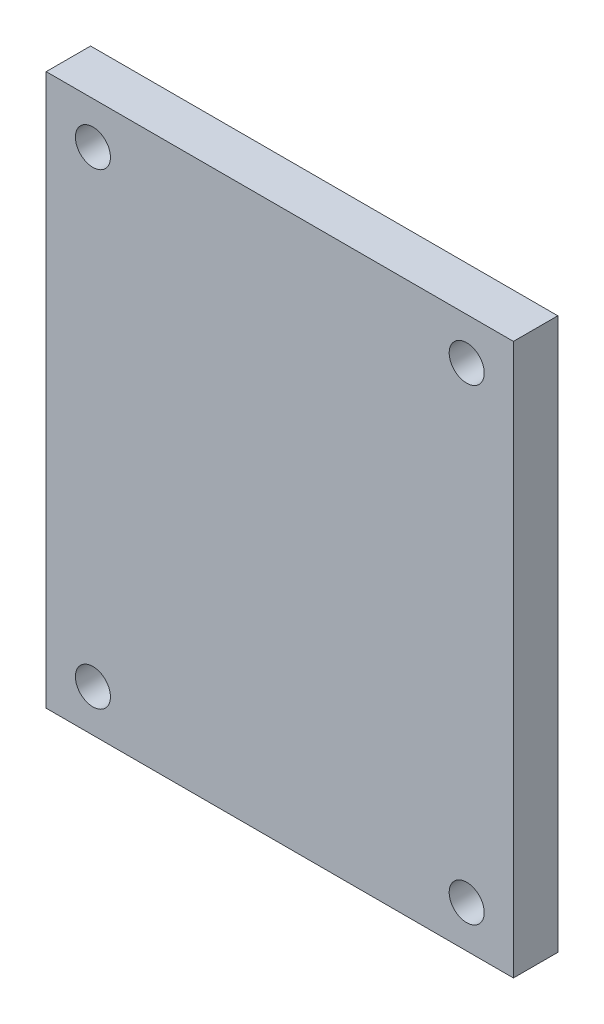
ISO-10303-21;
HEADER;
FILE_DESCRIPTION(('STEP AP214'),'2;1');
FILE_NAME('part.step','',(''),(''),'','','');
FILE_SCHEMA(('AUTOMOTIVE_DESIGN { 1 0 10303 214 1 1 1 1 }'));
ENDSEC;
DATA;
#1=APPLICATION_CONTEXT('core data for automotive mechanical design processes');
#2=APPLICATION_PROTOCOL_DEFINITION('international standard','automotive_design',2000,#1);
#3=PRODUCT_CONTEXT('',#1,'mechanical');
#4=PRODUCT('Part','Part','',(#3));
#5=PRODUCT_RELATED_PRODUCT_CATEGORY('part','',(#4));
#6=PRODUCT_DEFINITION_FORMATION('','',#4);
#7=PRODUCT_DEFINITION_CONTEXT('part definition',#1,'design');
#8=PRODUCT_DEFINITION('design','',#6,#7);
#9=PRODUCT_DEFINITION_SHAPE('','',#8);
#10=(LENGTH_UNIT() NAMED_UNIT(*) SI_UNIT(.MILLI.,.METRE.));
#11=(NAMED_UNIT(*) PLANE_ANGLE_UNIT() SI_UNIT($,.RADIAN.));
#12=(NAMED_UNIT(*) SI_UNIT($,.STERADIAN.) SOLID_ANGLE_UNIT());
#13=UNCERTAINTY_MEASURE_WITH_UNIT(LENGTH_MEASURE(1.E-05),#10,'distance_accuracy_value','');
#14=(GEOMETRIC_REPRESENTATION_CONTEXT(3) GLOBAL_UNCERTAINTY_ASSIGNED_CONTEXT((#13)) GLOBAL_UNIT_ASSIGNED_CONTEXT((#10,
#11,#12)) REPRESENTATION_CONTEXT('',''));
#15=CARTESIAN_POINT('',(0.,0.,0.));
#16=DIRECTION('',(0.,0.,1.));
#17=DIRECTION('',(1.,0.,0.));
#18=AXIS2_PLACEMENT_3D('',#15,#16,#17);
#19=CARTESIAN_POINT('',(0.,0.,4.826));
#20=DIRECTION('',(0.,0.,-1.));
#21=DIRECTION('',(-1.,0.,0.));
#22=AXIS2_PLACEMENT_3D('',#19,#20,#21);
#23=PLANE('',#22);
#24=DIRECTION('',(0.,-1.,0.));
#25=VECTOR('',#24,1.);
#26=CARTESIAN_POINT('',(0.,0.,4.826));
#27=LINE('',#26,#25);
#28=CARTESIAN_POINT('',(0.,59.944,4.826));
#29=VERTEX_POINT('',#28);
#30=CARTESIAN_POINT('',(0.,0.,4.826));
#31=VERTEX_POINT('',#30);
#32=EDGE_CURVE('E85',#29,#31,#27,.T.);
#33=ORIENTED_EDGE('',*,*,#32,.T.);
#34=DIRECTION('',(1.,0.,0.));
#35=VECTOR('',#34,1.);
#36=CARTESIAN_POINT('',(0.,0.,4.826));
#37=LINE('',#36,#35);
#38=CARTESIAN_POINT('',(50.8,0.,4.826));
#39=VERTEX_POINT('',#38);
#40=EDGE_CURVE('E80',#31,#39,#37,.T.);
#41=ORIENTED_EDGE('',*,*,#40,.T.);
#42=DIRECTION('',(0.,1.,0.));
#43=VECTOR('',#42,1.);
#44=CARTESIAN_POINT('',(50.8,0.,4.826));
#45=LINE('',#44,#43);
#46=CARTESIAN_POINT('',(50.8,59.944,4.826));
#47=VERTEX_POINT('',#46);
#48=EDGE_CURVE('E83',#39,#47,#45,.T.);
#49=ORIENTED_EDGE('',*,*,#48,.T.);
#50=DIRECTION('',(-1.,0.,0.));
#51=VECTOR('',#50,1.);
#52=CARTESIAN_POINT('',(0.,59.944,4.826));
#53=LINE('',#52,#51);
#54=EDGE_CURVE('E50',#47,#29,#53,.T.);
#55=ORIENTED_EDGE('',*,*,#54,.T.);
#56=EDGE_LOOP('',(#33,#41,#49,#55));
#57=FACE_BOUND('',#56,.T.);
#58=CARTESIAN_POINT('',(5.08,55.372,4.826));
#59=DIRECTION('',(0.,0.,1.));
#60=DIRECTION('',(1.,0.,0.));
#61=AXIS2_PLACEMENT_3D('',#58,#59,#60);
#62=CIRCLE('',#61,1.905);
#63=CARTESIAN_POINT('',(6.985,55.372,4.826));
#64=VERTEX_POINT('',#63);
#65=EDGE_CURVE('E100',#64,#64,#62,.T.);
#66=ORIENTED_EDGE('',*,*,#65,.F.);
#67=EDGE_LOOP('',(#66));
#68=FACE_BOUND('',#67,.T.);
#69=CARTESIAN_POINT('',(5.08,4.57200000000001,4.826));
#70=DIRECTION('',(0.,0.,1.));
#71=DIRECTION('',(1.,0.,0.));
#72=AXIS2_PLACEMENT_3D('',#69,#70,#71);
#73=CIRCLE('',#72,1.905);
#74=CARTESIAN_POINT('',(6.985,4.57200000000001,4.826));
#75=VERTEX_POINT('',#74);
#76=EDGE_CURVE('E115',#75,#75,#73,.T.);
#77=ORIENTED_EDGE('',*,*,#76,.F.);
#78=EDGE_LOOP('',(#77));
#79=FACE_BOUND('',#78,.T.);
#80=CARTESIAN_POINT('',(45.72,55.372,4.826));
#81=DIRECTION('',(0.,0.,1.));
#82=DIRECTION('',(1.,0.,0.));
#83=AXIS2_PLACEMENT_3D('',#80,#81,#82);
#84=CIRCLE('',#83,1.905);
#85=CARTESIAN_POINT('',(47.625,55.372,4.826));
#86=VERTEX_POINT('',#85);
#87=EDGE_CURVE('E121',#86,#86,#84,.T.);
#88=ORIENTED_EDGE('',*,*,#87,.F.);
#89=EDGE_LOOP('',(#88));
#90=FACE_BOUND('',#89,.T.);
#91=CARTESIAN_POINT('',(45.72,4.57200000000003,4.826));
#92=DIRECTION('',(0.,0.,1.));
#93=DIRECTION('',(1.,0.,0.));
#94=AXIS2_PLACEMENT_3D('',#91,#92,#93);
#95=CIRCLE('',#94,1.905);
#96=CARTESIAN_POINT('',(47.625,4.57200000000003,4.826));
#97=VERTEX_POINT('',#96);
#98=EDGE_CURVE('E127',#97,#97,#95,.T.);
#99=ORIENTED_EDGE('',*,*,#98,.F.);
#100=EDGE_LOOP('',(#99));
#101=FACE_BOUND('',#100,.T.);
#102=ADVANCED_FACE('F33',(#57,#68,#79,#90,#101),#23,.F.);
#103=CARTESIAN_POINT('',(0.,0.,0.));
#104=DIRECTION('',(0.,0.,-1.));
#105=DIRECTION('',(-1.,0.,0.));
#106=AXIS2_PLACEMENT_3D('',#103,#104,#105);
#107=PLANE('',#106);
#108=CARTESIAN_POINT('',(45.72,55.372,0.));
#109=DIRECTION('',(0.,0.,1.));
#110=DIRECTION('',(1.,0.,0.));
#111=AXIS2_PLACEMENT_3D('',#108,#109,#110);
#112=CIRCLE('',#111,1.905);
#113=CARTESIAN_POINT('',(47.625,55.372,0.));
#114=VERTEX_POINT('',#113);
#115=EDGE_CURVE('E124',#114,#114,#112,.T.);
#116=ORIENTED_EDGE('',*,*,#115,.T.);
#117=EDGE_LOOP('',(#116));
#118=FACE_BOUND('',#117,.T.);
#119=CARTESIAN_POINT('',(5.08,55.372,0.));
#120=DIRECTION('',(0.,0.,1.));
#121=DIRECTION('',(1.,0.,0.));
#122=AXIS2_PLACEMENT_3D('',#119,#120,#121);
#123=CIRCLE('',#122,1.905);
#124=CARTESIAN_POINT('',(6.985,55.372,0.));
#125=VERTEX_POINT('',#124);
#126=EDGE_CURVE('E112',#125,#125,#123,.T.);
#127=ORIENTED_EDGE('',*,*,#126,.T.);
#128=EDGE_LOOP('',(#127));
#129=FACE_BOUND('',#128,.T.);
#130=DIRECTION('',(0.,-1.,0.));
#131=VECTOR('',#130,1.);
#132=CARTESIAN_POINT('',(0.,0.,0.));
#133=LINE('',#132,#131);
#134=CARTESIAN_POINT('',(0.,59.944,0.));
#135=VERTEX_POINT('',#134);
#136=CARTESIAN_POINT('',(0.,0.,0.));
#137=VERTEX_POINT('',#136);
#138=EDGE_CURVE('E97',#135,#137,#133,.T.);
#139=ORIENTED_EDGE('',*,*,#138,.F.);
#140=DIRECTION('',(-1.,0.,0.));
#141=VECTOR('',#140,1.);
#142=CARTESIAN_POINT('',(0.,59.944,0.));
#143=LINE('',#142,#141);
#144=CARTESIAN_POINT('',(50.8,59.944,0.));
#145=VERTEX_POINT('',#144);
#146=EDGE_CURVE('E73',#145,#135,#143,.T.);
#147=ORIENTED_EDGE('',*,*,#146,.F.);
#148=DIRECTION('',(0.,1.,0.));
#149=VECTOR('',#148,1.);
#150=CARTESIAN_POINT('',(50.8,0.,0.));
#151=LINE('',#150,#149);
#152=CARTESIAN_POINT('',(50.8,0.,0.));
#153=VERTEX_POINT('',#152);
#154=EDGE_CURVE('E67',#153,#145,#151,.T.);
#155=ORIENTED_EDGE('',*,*,#154,.F.);
#156=DIRECTION('',(1.,0.,0.));
#157=VECTOR('',#156,1.);
#158=CARTESIAN_POINT('',(0.,0.,0.));
#159=LINE('',#158,#157);
#160=EDGE_CURVE('E89',#137,#153,#159,.T.);
#161=ORIENTED_EDGE('',*,*,#160,.F.);
#162=EDGE_LOOP('',(#139,#147,#155,#161));
#163=FACE_BOUND('',#162,.T.);
#164=CARTESIAN_POINT('',(5.08,4.57200000000001,0.));
#165=DIRECTION('',(0.,0.,1.));
#166=DIRECTION('',(1.,0.,0.));
#167=AXIS2_PLACEMENT_3D('',#164,#165,#166);
#168=CIRCLE('',#167,1.905);
#169=CARTESIAN_POINT('',(6.985,4.57200000000001,0.));
#170=VERTEX_POINT('',#169);
#171=EDGE_CURVE('E118',#170,#170,#168,.T.);
#172=ORIENTED_EDGE('',*,*,#171,.T.);
#173=EDGE_LOOP('',(#172));
#174=FACE_BOUND('',#173,.T.);
#175=CARTESIAN_POINT('',(45.72,4.57200000000003,0.));
#176=DIRECTION('',(0.,0.,1.));
#177=DIRECTION('',(1.,0.,0.));
#178=AXIS2_PLACEMENT_3D('',#175,#176,#177);
#179=CIRCLE('',#178,1.905);
#180=CARTESIAN_POINT('',(47.625,4.57200000000003,0.));
#181=VERTEX_POINT('',#180);
#182=EDGE_CURVE('E130',#181,#181,#179,.T.);
#183=ORIENTED_EDGE('',*,*,#182,.T.);
#184=EDGE_LOOP('',(#183));
#185=FACE_BOUND('',#184,.T.);
#186=ADVANCED_FACE('F108',(#118,#129,#163,#174,#185),#107,.T.);
#187=CARTESIAN_POINT('',(0.,0.,4.826));
#188=DIRECTION('',(1.,0.,0.));
#189=DIRECTION('',(0.,0.,-1.));
#190=AXIS2_PLACEMENT_3D('',#187,#188,#189);
#191=PLANE('',#190);
#192=ORIENTED_EDGE('',*,*,#138,.T.);
#193=DIRECTION('',(0.,0.,-1.));
#194=VECTOR('',#193,1.);
#195=CARTESIAN_POINT('',(0.,0.,4.826));
#196=LINE('',#195,#194);
#197=EDGE_CURVE('E11',#31,#137,#196,.T.);
#198=ORIENTED_EDGE('',*,*,#197,.F.);
#199=ORIENTED_EDGE('',*,*,#32,.F.);
#200=DIRECTION('',(0.,0.,-1.));
#201=VECTOR('',#200,1.);
#202=CARTESIAN_POINT('',(0.,59.944,4.826));
#203=LINE('',#202,#201);
#204=EDGE_CURVE('E93',#29,#135,#203,.T.);
#205=ORIENTED_EDGE('',*,*,#204,.T.);
#206=EDGE_LOOP('',(#192,#198,#199,#205));
#207=FACE_BOUND('',#206,.T.);
#208=ADVANCED_FACE('F35',(#207),#191,.F.);
#209=CARTESIAN_POINT('',(0.,0.,4.826));
#210=DIRECTION('',(0.,1.,0.));
#211=DIRECTION('',(0.,0.,1.));
#212=AXIS2_PLACEMENT_3D('',#209,#210,#211);
#213=PLANE('',#212);
#214=ORIENTED_EDGE('',*,*,#160,.T.);
#215=DIRECTION('',(0.,0.,-1.));
#216=VECTOR('',#215,1.);
#217=CARTESIAN_POINT('',(50.8,0.,4.826));
#218=LINE('',#217,#216);
#219=EDGE_CURVE('E42',#39,#153,#218,.T.);
#220=ORIENTED_EDGE('',*,*,#219,.F.);
#221=ORIENTED_EDGE('',*,*,#40,.F.);
#222=ORIENTED_EDGE('',*,*,#197,.T.);
#223=EDGE_LOOP('',(#214,#220,#221,#222));
#224=FACE_BOUND('',#223,.T.);
#225=ADVANCED_FACE('F88',(#224),#213,.F.);
#226=CARTESIAN_POINT('',(50.8,0.,4.826));
#227=DIRECTION('',(-1.,0.,0.));
#228=DIRECTION('',(0.,-1.,0.));
#229=AXIS2_PLACEMENT_3D('',#226,#227,#228);
#230=PLANE('',#229);
#231=ORIENTED_EDGE('',*,*,#154,.T.);
#232=DIRECTION('',(0.,0.,-1.));
#233=VECTOR('',#232,1.);
#234=CARTESIAN_POINT('',(50.8,59.944,4.826));
#235=LINE('',#234,#233);
#236=EDGE_CURVE('E90',#47,#145,#235,.T.);
#237=ORIENTED_EDGE('',*,*,#236,.F.);
#238=ORIENTED_EDGE('',*,*,#48,.F.);
#239=ORIENTED_EDGE('',*,*,#219,.T.);
#240=EDGE_LOOP('',(#231,#237,#238,#239));
#241=FACE_BOUND('',#240,.T.);
#242=ADVANCED_FACE('F91',(#241),#230,.F.);
#243=CARTESIAN_POINT('',(0.,59.944,4.826));
#244=DIRECTION('',(0.,-1.,0.));
#245=DIRECTION('',(0.,0.,-1.));
#246=AXIS2_PLACEMENT_3D('',#243,#244,#245);
#247=PLANE('',#246);
#248=ORIENTED_EDGE('',*,*,#146,.T.);
#249=ORIENTED_EDGE('',*,*,#204,.F.);
#250=ORIENTED_EDGE('',*,*,#54,.F.);
#251=ORIENTED_EDGE('',*,*,#236,.T.);
#252=EDGE_LOOP('',(#248,#249,#250,#251));
#253=FACE_BOUND('',#252,.T.);
#254=ADVANCED_FACE('F105',(#253),#247,.F.);
#255=CARTESIAN_POINT('',(5.08,55.372,4.826));
#256=DIRECTION('',(0.,0.,-1.));
#257=DIRECTION('',(-1.,0.,0.));
#258=AXIS2_PLACEMENT_3D('',#255,#256,#257);
#259=CYLINDRICAL_SURFACE('',#258,1.905);
#260=ORIENTED_EDGE('',*,*,#65,.T.);
#261=EDGE_LOOP('',(#260));
#262=FACE_BOUND('',#261,.T.);
#263=ORIENTED_EDGE('',*,*,#126,.F.);
#264=EDGE_LOOP('',(#263));
#265=FACE_BOUND('',#264,.T.);
#266=ADVANCED_FACE('F147',(#262,#265),#259,.F.);
#267=CARTESIAN_POINT('',(5.08,4.57200000000001,4.826));
#268=DIRECTION('',(0.,0.,-1.));
#269=DIRECTION('',(-1.,0.,0.));
#270=AXIS2_PLACEMENT_3D('',#267,#268,#269);
#271=CYLINDRICAL_SURFACE('',#270,1.905);
#272=ORIENTED_EDGE('',*,*,#76,.T.);
#273=EDGE_LOOP('',(#272));
#274=FACE_BOUND('',#273,.T.);
#275=ORIENTED_EDGE('',*,*,#171,.F.);
#276=EDGE_LOOP('',(#275));
#277=FACE_BOUND('',#276,.T.);
#278=ADVANCED_FACE('F193',(#274,#277),#271,.F.);
#279=CARTESIAN_POINT('',(45.72,55.372,4.826));
#280=DIRECTION('',(0.,0.,-1.));
#281=DIRECTION('',(-1.,0.,0.));
#282=AXIS2_PLACEMENT_3D('',#279,#280,#281);
#283=CYLINDRICAL_SURFACE('',#282,1.905);
#284=ORIENTED_EDGE('',*,*,#87,.T.);
#285=EDGE_LOOP('',(#284));
#286=FACE_BOUND('',#285,.T.);
#287=ORIENTED_EDGE('',*,*,#115,.F.);
#288=EDGE_LOOP('',(#287));
#289=FACE_BOUND('',#288,.T.);
#290=ADVANCED_FACE('F201',(#286,#289),#283,.F.);
#291=CARTESIAN_POINT('',(45.72,4.57200000000003,4.826));
#292=DIRECTION('',(0.,0.,-1.));
#293=DIRECTION('',(-1.,0.,0.));
#294=AXIS2_PLACEMENT_3D('',#291,#292,#293);
#295=CYLINDRICAL_SURFACE('',#294,1.905);
#296=ORIENTED_EDGE('',*,*,#98,.T.);
#297=EDGE_LOOP('',(#296));
#298=FACE_BOUND('',#297,.T.);
#299=ORIENTED_EDGE('',*,*,#182,.F.);
#300=EDGE_LOOP('',(#299));
#301=FACE_BOUND('',#300,.T.);
#302=ADVANCED_FACE('F136',(#298,#301),#295,.F.);
#303=CLOSED_SHELL('',(#102,#186,#208,#225,#242,#254,#266,#278,#290,#302));
#304=MANIFOLD_SOLID_BREP('B2',#303);
#305=ADVANCED_BREP_SHAPE_REPRESENTATION('',(#18,#304),#14);
#306=SHAPE_DEFINITION_REPRESENTATION(#9,#305);
ENDSEC;
END-ISO-10303-21;
